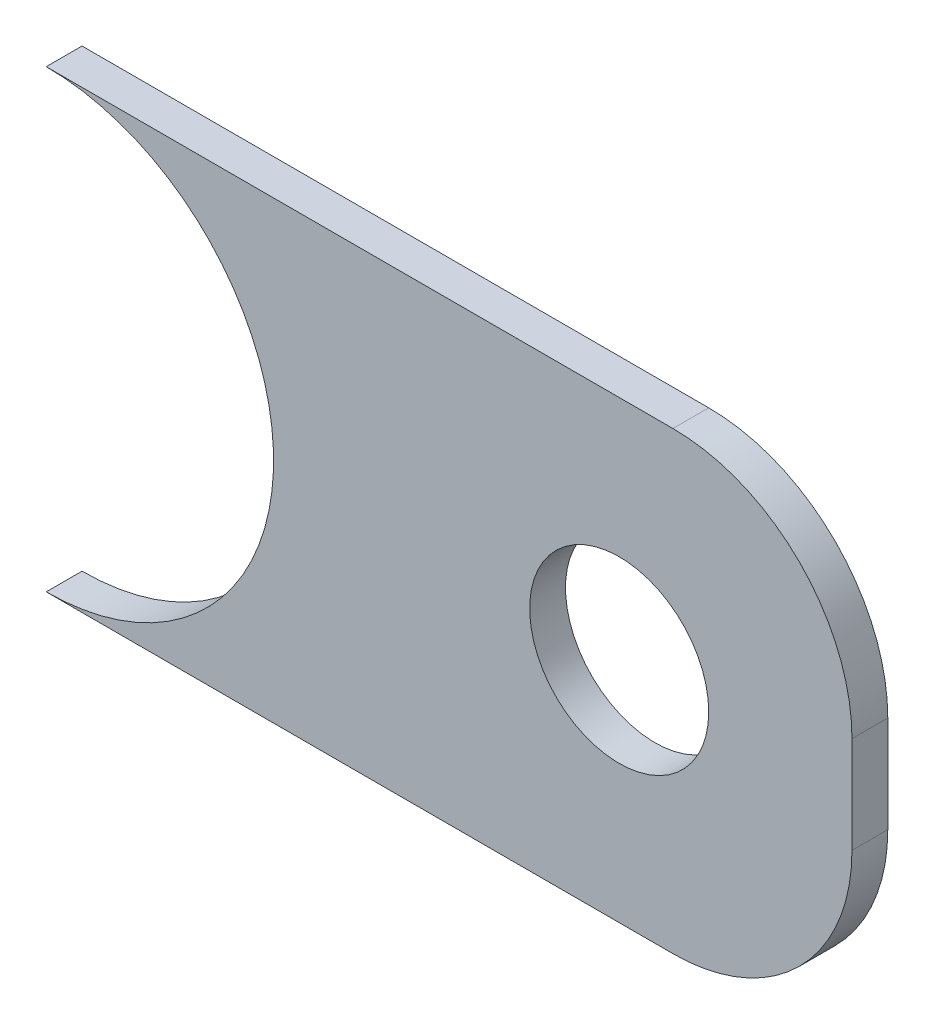
ISO-10303-21;
HEADER;
FILE_DESCRIPTION(('STEP AP214'),'2;1');
FILE_NAME('part.step','',(''),(''),'','','');
FILE_SCHEMA(('AUTOMOTIVE_DESIGN { 1 0 10303 214 1 1 1 1 }'));
ENDSEC;
DATA;
#1=APPLICATION_CONTEXT('core data for automotive mechanical design processes');
#2=APPLICATION_PROTOCOL_DEFINITION('international standard','automotive_design',2000,#1);
#3=PRODUCT_CONTEXT('',#1,'mechanical');
#4=PRODUCT('Part','Part','',(#3));
#5=PRODUCT_RELATED_PRODUCT_CATEGORY('part','',(#4));
#6=PRODUCT_DEFINITION_FORMATION('','',#4);
#7=PRODUCT_DEFINITION_CONTEXT('part definition',#1,'design');
#8=PRODUCT_DEFINITION('design','',#6,#7);
#9=PRODUCT_DEFINITION_SHAPE('','',#8);
#10=(LENGTH_UNIT() NAMED_UNIT(*) SI_UNIT(.MILLI.,.METRE.));
#11=(NAMED_UNIT(*) PLANE_ANGLE_UNIT() SI_UNIT($,.RADIAN.));
#12=(NAMED_UNIT(*) SI_UNIT($,.STERADIAN.) SOLID_ANGLE_UNIT());
#13=UNCERTAINTY_MEASURE_WITH_UNIT(LENGTH_MEASURE(1.E-05),#10,'distance_accuracy_value','');
#14=(GEOMETRIC_REPRESENTATION_CONTEXT(3) GLOBAL_UNCERTAINTY_ASSIGNED_CONTEXT((#13)) GLOBAL_UNIT_ASSIGNED_CONTEXT((#10,
#11,#12)) REPRESENTATION_CONTEXT('',''));
#15=CARTESIAN_POINT('',(0.,0.,0.));
#16=DIRECTION('',(0.,0.,1.));
#17=DIRECTION('',(1.,0.,0.));
#18=AXIS2_PLACEMENT_3D('',#15,#16,#17);
#19=CARTESIAN_POINT('',(0.,0.,2.));
#20=DIRECTION('',(0.,0.,1.));
#21=DIRECTION('',(1.,0.,0.));
#22=AXIS2_PLACEMENT_3D('',#19,#20,#21);
#23=PLANE('',#22);
#24=CARTESIAN_POINT('',(0.,0.,2.));
#25=DIRECTION('',(0.,0.,-1.));
#26=DIRECTION('',(1.,0.,0.));
#27=AXIS2_PLACEMENT_3D('',#24,#25,#26);
#28=CIRCLE('',#27,12.7);
#29=CARTESIAN_POINT('',(0.,12.7,2.));
#30=VERTEX_POINT('',#29);
#31=CARTESIAN_POINT('',(0.,-12.7,2.));
#32=VERTEX_POINT('',#31);
#33=EDGE_CURVE('E131',#30,#32,#28,.T.);
#34=ORIENTED_EDGE('',*,*,#33,.T.);
#35=DIRECTION('',(1.,0.,0.));
#36=VECTOR('',#35,1.);
#37=CARTESIAN_POINT('',(0.,-12.7,2.));
#38=LINE('',#37,#36);
#39=CARTESIAN_POINT('',(34.9999999999999,-12.7,2.));
#40=VERTEX_POINT('',#39);
#41=EDGE_CURVE('E89',#32,#40,#38,.T.);
#42=ORIENTED_EDGE('',*,*,#41,.T.);
#43=CARTESIAN_POINT('',(35.,-2.7,2.));
#44=DIRECTION('',(0.,0.,1.));
#45=DIRECTION('',(1.,0.,0.));
#46=AXIS2_PLACEMENT_3D('',#43,#44,#45);
#47=CIRCLE('',#46,10.);
#48=CARTESIAN_POINT('',(45.,-2.69999999999993,2.));
#49=VERTEX_POINT('',#48);
#50=EDGE_CURVE('E102',#40,#49,#47,.T.);
#51=ORIENTED_EDGE('',*,*,#50,.T.);
#52=DIRECTION('',(0.,1.,0.));
#53=VECTOR('',#52,1.);
#54=CARTESIAN_POINT('',(45.,2.69999999999993,2.));
#55=LINE('',#54,#53);
#56=CARTESIAN_POINT('',(45.,2.69999999999993,2.));
#57=VERTEX_POINT('',#56);
#58=EDGE_CURVE('E96',#49,#57,#55,.T.);
#59=ORIENTED_EDGE('',*,*,#58,.T.);
#60=CARTESIAN_POINT('',(35.,2.7,2.));
#61=DIRECTION('',(0.,0.,1.));
#62=DIRECTION('',(-1.,0.,0.));
#63=AXIS2_PLACEMENT_3D('',#60,#61,#62);
#64=CIRCLE('',#63,10.);
#65=CARTESIAN_POINT('',(34.9999999999999,12.7,2.));
#66=VERTEX_POINT('',#65);
#67=EDGE_CURVE('E100',#57,#66,#64,.T.);
#68=ORIENTED_EDGE('',*,*,#67,.T.);
#69=DIRECTION('',(-1.,0.,0.));
#70=VECTOR('',#69,1.);
#71=CARTESIAN_POINT('',(0.,12.7,2.));
#72=LINE('',#71,#70);
#73=EDGE_CURVE('E52',#66,#30,#72,.T.);
#74=ORIENTED_EDGE('',*,*,#73,.T.);
#75=EDGE_LOOP('',(#34,#42,#51,#59,#68,#74));
#76=FACE_BOUND('',#75,.T.);
#77=CARTESIAN_POINT('',(32.,0.,2.));
#78=DIRECTION('',(0.,0.,1.));
#79=DIRECTION('',(1.,0.,0.));
#80=AXIS2_PLACEMENT_3D('',#77,#78,#79);
#81=CIRCLE('',#80,5.);
#82=CARTESIAN_POINT('',(37.,0.,2.));
#83=VERTEX_POINT('',#82);
#84=EDGE_CURVE('E124',#83,#83,#81,.T.);
#85=ORIENTED_EDGE('',*,*,#84,.F.);
#86=EDGE_LOOP('',(#85));
#87=FACE_BOUND('',#86,.T.);
#88=ADVANCED_FACE('F35',(#76,#87),#23,.T.);
#89=CARTESIAN_POINT('',(0.,0.,0.));
#90=DIRECTION('',(0.,0.,1.));
#91=DIRECTION('',(1.,0.,0.));
#92=AXIS2_PLACEMENT_3D('',#89,#90,#91);
#93=PLANE('',#92);
#94=CARTESIAN_POINT('',(0.,0.,0.));
#95=DIRECTION('',(0.,0.,-1.));
#96=DIRECTION('',(1.,0.,0.));
#97=AXIS2_PLACEMENT_3D('',#94,#95,#96);
#98=CIRCLE('',#97,12.7);
#99=CARTESIAN_POINT('',(0.,12.7,0.));
#100=VERTEX_POINT('',#99);
#101=CARTESIAN_POINT('',(0.,-12.7,0.));
#102=VERTEX_POINT('',#101);
#103=EDGE_CURVE('E120',#100,#102,#98,.T.);
#104=ORIENTED_EDGE('',*,*,#103,.F.);
#105=DIRECTION('',(-1.,0.,0.));
#106=VECTOR('',#105,1.);
#107=CARTESIAN_POINT('',(0.,12.7,0.));
#108=LINE('',#107,#106);
#109=CARTESIAN_POINT('',(34.9999999999999,12.7,0.));
#110=VERTEX_POINT('',#109);
#111=EDGE_CURVE('E81',#110,#100,#108,.T.);
#112=ORIENTED_EDGE('',*,*,#111,.F.);
#113=CARTESIAN_POINT('',(35.,2.7,0.));
#114=DIRECTION('',(0.,0.,1.));
#115=DIRECTION('',(-1.,0.,0.));
#116=AXIS2_PLACEMENT_3D('',#113,#114,#115);
#117=CIRCLE('',#116,10.);
#118=CARTESIAN_POINT('',(45.,2.69999999999993,0.));
#119=VERTEX_POINT('',#118);
#120=EDGE_CURVE('E75',#119,#110,#117,.T.);
#121=ORIENTED_EDGE('',*,*,#120,.F.);
#122=DIRECTION('',(0.,1.,0.));
#123=VECTOR('',#122,1.);
#124=CARTESIAN_POINT('',(45.,2.69999999999993,0.));
#125=LINE('',#124,#123);
#126=CARTESIAN_POINT('',(45.,-2.69999999999993,0.));
#127=VERTEX_POINT('',#126);
#128=EDGE_CURVE('E110',#127,#119,#125,.T.);
#129=ORIENTED_EDGE('',*,*,#128,.F.);
#130=CARTESIAN_POINT('',(35.,-2.7,0.));
#131=DIRECTION('',(0.,0.,1.));
#132=DIRECTION('',(1.,0.,0.));
#133=AXIS2_PLACEMENT_3D('',#130,#131,#132);
#134=CIRCLE('',#133,10.);
#135=CARTESIAN_POINT('',(34.9999999999999,-12.7,0.));
#136=VERTEX_POINT('',#135);
#137=EDGE_CURVE('E126',#136,#127,#134,.T.);
#138=ORIENTED_EDGE('',*,*,#137,.F.);
#139=DIRECTION('',(1.,0.,0.));
#140=VECTOR('',#139,1.);
#141=CARTESIAN_POINT('',(0.,-12.7,0.));
#142=LINE('',#141,#140);
#143=EDGE_CURVE('E123',#102,#136,#142,.T.);
#144=ORIENTED_EDGE('',*,*,#143,.F.);
#145=EDGE_LOOP('',(#104,#112,#121,#129,#138,#144));
#146=FACE_BOUND('',#145,.T.);
#147=CARTESIAN_POINT('',(32.,0.,0.));
#148=DIRECTION('',(0.,0.,1.));
#149=DIRECTION('',(1.,0.,0.));
#150=AXIS2_PLACEMENT_3D('',#147,#148,#149);
#151=CIRCLE('',#150,5.);
#152=CARTESIAN_POINT('',(37.,0.,0.));
#153=VERTEX_POINT('',#152);
#154=EDGE_CURVE('E224',#153,#153,#151,.T.);
#155=ORIENTED_EDGE('',*,*,#154,.T.);
#156=EDGE_LOOP('',(#155));
#157=FACE_BOUND('',#156,.T.);
#158=ADVANCED_FACE('F140',(#146,#157),#93,.F.);
#159=CARTESIAN_POINT('',(0.,0.,2.));
#160=DIRECTION('',(0.,0.,-1.));
#161=DIRECTION('',(-1.,0.,0.));
#162=AXIS2_PLACEMENT_3D('',#159,#160,#161);
#163=CYLINDRICAL_SURFACE('',#162,12.7);
#164=ORIENTED_EDGE('',*,*,#103,.T.);
#165=DIRECTION('',(0.,0.,-1.));
#166=VECTOR('',#165,1.);
#167=CARTESIAN_POINT('',(0.,-12.7,2.));
#168=LINE('',#167,#166);
#169=EDGE_CURVE('E11',#32,#102,#168,.T.);
#170=ORIENTED_EDGE('',*,*,#169,.F.);
#171=ORIENTED_EDGE('',*,*,#33,.F.);
#172=DIRECTION('',(0.,0.,-1.));
#173=VECTOR('',#172,1.);
#174=CARTESIAN_POINT('',(0.,12.7,2.));
#175=LINE('',#174,#173);
#176=EDGE_CURVE('E116',#30,#100,#175,.T.);
#177=ORIENTED_EDGE('',*,*,#176,.T.);
#178=EDGE_LOOP('',(#164,#170,#171,#177));
#179=FACE_BOUND('',#178,.T.);
#180=ADVANCED_FACE('F37',(#179),#163,.F.);
#181=CARTESIAN_POINT('',(0.,-12.7,2.));
#182=DIRECTION('',(0.,1.,0.));
#183=DIRECTION('',(0.,0.,1.));
#184=AXIS2_PLACEMENT_3D('',#181,#182,#183);
#185=PLANE('',#184);
#186=ORIENTED_EDGE('',*,*,#143,.T.);
#187=DIRECTION('',(0.,0.,-1.));
#188=VECTOR('',#187,1.);
#189=CARTESIAN_POINT('',(34.9999999999999,-12.7,2.));
#190=LINE('',#189,#188);
#191=EDGE_CURVE('E44',#40,#136,#190,.T.);
#192=ORIENTED_EDGE('',*,*,#191,.F.);
#193=ORIENTED_EDGE('',*,*,#41,.F.);
#194=ORIENTED_EDGE('',*,*,#169,.T.);
#195=EDGE_LOOP('',(#186,#192,#193,#194));
#196=FACE_BOUND('',#195,.T.);
#197=ADVANCED_FACE('F165',(#196),#185,.F.);
#198=CARTESIAN_POINT('',(35.,-2.7,2.));
#199=DIRECTION('',(0.,0.,-1.));
#200=DIRECTION('',(-1.,0.,0.));
#201=AXIS2_PLACEMENT_3D('',#198,#199,#200);
#202=CYLINDRICAL_SURFACE('',#201,10.);
#203=ORIENTED_EDGE('',*,*,#137,.T.);
#204=DIRECTION('',(0.,0.,-1.));
#205=VECTOR('',#204,1.);
#206=CARTESIAN_POINT('',(45.,-2.69999999999993,2.));
#207=LINE('',#206,#205);
#208=EDGE_CURVE('E111',#49,#127,#207,.T.);
#209=ORIENTED_EDGE('',*,*,#208,.F.);
#210=ORIENTED_EDGE('',*,*,#50,.F.);
#211=ORIENTED_EDGE('',*,*,#191,.T.);
#212=EDGE_LOOP('',(#203,#209,#210,#211));
#213=FACE_BOUND('',#212,.T.);
#214=ADVANCED_FACE('F137',(#213),#202,.T.);
#215=CARTESIAN_POINT('',(45.,2.69999999999993,2.));
#216=DIRECTION('',(-1.,0.,0.));
#217=DIRECTION('',(0.,0.,1.));
#218=AXIS2_PLACEMENT_3D('',#215,#216,#217);
#219=PLANE('',#218);
#220=ORIENTED_EDGE('',*,*,#128,.T.);
#221=DIRECTION('',(0.,0.,-1.));
#222=VECTOR('',#221,1.);
#223=CARTESIAN_POINT('',(45.,2.69999999999993,2.));
#224=LINE('',#223,#222);
#225=EDGE_CURVE('E107',#57,#119,#224,.T.);
#226=ORIENTED_EDGE('',*,*,#225,.F.);
#227=ORIENTED_EDGE('',*,*,#58,.F.);
#228=ORIENTED_EDGE('',*,*,#208,.T.);
#229=EDGE_LOOP('',(#220,#226,#227,#228));
#230=FACE_BOUND('',#229,.T.);
#231=ADVANCED_FACE('F108',(#230),#219,.F.);
#232=CARTESIAN_POINT('',(35.,2.7,2.));
#233=DIRECTION('',(0.,0.,-1.));
#234=DIRECTION('',(-1.,0.,0.));
#235=AXIS2_PLACEMENT_3D('',#232,#233,#234);
#236=CYLINDRICAL_SURFACE('',#235,10.);
#237=ORIENTED_EDGE('',*,*,#120,.T.);
#238=DIRECTION('',(0.,0.,-1.));
#239=VECTOR('',#238,1.);
#240=CARTESIAN_POINT('',(34.9999999999999,12.7,2.));
#241=LINE('',#240,#239);
#242=EDGE_CURVE('E112',#66,#110,#241,.T.);
#243=ORIENTED_EDGE('',*,*,#242,.F.);
#244=ORIENTED_EDGE('',*,*,#67,.F.);
#245=ORIENTED_EDGE('',*,*,#225,.T.);
#246=EDGE_LOOP('',(#237,#243,#244,#245));
#247=FACE_BOUND('',#246,.T.);
#248=ADVANCED_FACE('F114',(#247),#236,.T.);
#249=CARTESIAN_POINT('',(0.,12.7,2.));
#250=DIRECTION('',(0.,-1.,0.));
#251=DIRECTION('',(0.,0.,-1.));
#252=AXIS2_PLACEMENT_3D('',#249,#250,#251);
#253=PLANE('',#252);
#254=ORIENTED_EDGE('',*,*,#111,.T.);
#255=ORIENTED_EDGE('',*,*,#176,.F.);
#256=ORIENTED_EDGE('',*,*,#73,.F.);
#257=ORIENTED_EDGE('',*,*,#242,.T.);
#258=EDGE_LOOP('',(#254,#255,#256,#257));
#259=FACE_BOUND('',#258,.T.);
#260=ADVANCED_FACE('F145',(#259),#253,.F.);
#261=CARTESIAN_POINT('',(32.,0.,2.));
#262=DIRECTION('',(0.,0.,-1.));
#263=DIRECTION('',(-1.,0.,0.));
#264=AXIS2_PLACEMENT_3D('',#261,#262,#263);
#265=CYLINDRICAL_SURFACE('',#264,5.);
#266=ORIENTED_EDGE('',*,*,#84,.T.);
#267=EDGE_LOOP('',(#266));
#268=FACE_BOUND('',#267,.T.);
#269=ORIENTED_EDGE('',*,*,#154,.F.);
#270=EDGE_LOOP('',(#269));
#271=FACE_BOUND('',#270,.T.);
#272=ADVANCED_FACE('F147',(#268,#271),#265,.F.);
#273=CLOSED_SHELL('',(#88,#158,#180,#197,#214,#231,#248,#260,#272));
#274=MANIFOLD_SOLID_BREP('B2',#273);
#275=ADVANCED_BREP_SHAPE_REPRESENTATION('',(#18,#274),#14);
#276=SHAPE_DEFINITION_REPRESENTATION(#9,#275);
ENDSEC;
END-ISO-10303-21;
